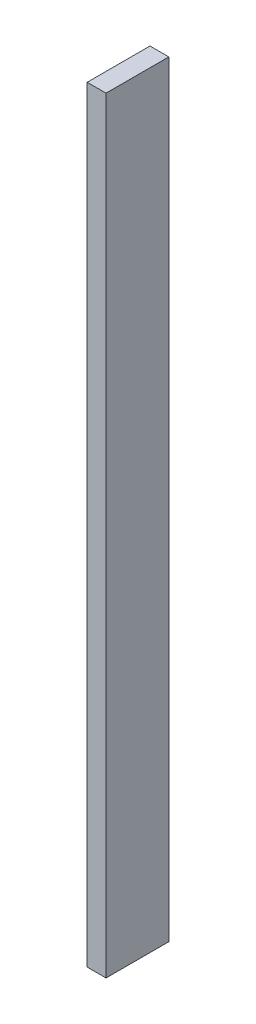
ISO-10303-21;
HEADER;
FILE_DESCRIPTION(('STEP AP214'),'2;1');
FILE_NAME('part.step','',(''),(''),'','','');
FILE_SCHEMA(('AUTOMOTIVE_DESIGN { 1 0 10303 214 1 1 1 1 }'));
ENDSEC;
DATA;
#1=APPLICATION_CONTEXT('core data for automotive mechanical design processes');
#2=APPLICATION_PROTOCOL_DEFINITION('international standard','automotive_design',2000,#1);
#3=PRODUCT_CONTEXT('',#1,'mechanical');
#4=PRODUCT('Part','Part','',(#3));
#5=PRODUCT_RELATED_PRODUCT_CATEGORY('part','',(#4));
#6=PRODUCT_DEFINITION_FORMATION('','',#4);
#7=PRODUCT_DEFINITION_CONTEXT('part definition',#1,'design');
#8=PRODUCT_DEFINITION('design','',#6,#7);
#9=PRODUCT_DEFINITION_SHAPE('','',#8);
#10=(LENGTH_UNIT() NAMED_UNIT(*) SI_UNIT(.MILLI.,.METRE.));
#11=(NAMED_UNIT(*) PLANE_ANGLE_UNIT() SI_UNIT($,.RADIAN.));
#12=(NAMED_UNIT(*) SI_UNIT($,.STERADIAN.) SOLID_ANGLE_UNIT());
#13=UNCERTAINTY_MEASURE_WITH_UNIT(LENGTH_MEASURE(1.E-05),#10,'distance_accuracy_value','');
#14=(GEOMETRIC_REPRESENTATION_CONTEXT(3) GLOBAL_UNCERTAINTY_ASSIGNED_CONTEXT((#13)) GLOBAL_UNIT_ASSIGNED_CONTEXT((#10,
#11,#12)) REPRESENTATION_CONTEXT('',''));
#15=CARTESIAN_POINT('',(0.,0.,0.));
#16=DIRECTION('',(0.,0.,1.));
#17=DIRECTION('',(1.,0.,0.));
#18=AXIS2_PLACEMENT_3D('',#15,#16,#17);
#19=CARTESIAN_POINT('',(1.5,61.,10.));
#20=DIRECTION('',(0.,-1.,0.));
#21=DIRECTION('',(0.,0.,-1.));
#22=AXIS2_PLACEMENT_3D('',#19,#20,#21);
#23=PLANE('',#22);
#24=DIRECTION('',(-1.,0.,0.));
#25=VECTOR('',#24,1.);
#26=CARTESIAN_POINT('',(1.5,61.,0.));
#27=LINE('',#26,#25);
#28=CARTESIAN_POINT('',(1.5,61.,0.));
#29=VERTEX_POINT('',#28);
#30=CARTESIAN_POINT('',(-1.5,61.,0.));
#31=VERTEX_POINT('',#30);
#32=EDGE_CURVE('E105',#29,#31,#27,.T.);
#33=ORIENTED_EDGE('',*,*,#32,.T.);
#34=DIRECTION('',(0.,0.,-1.));
#35=VECTOR('',#34,1.);
#36=CARTESIAN_POINT('',(-1.5,61.,10.));
#37=LINE('',#36,#35);
#38=CARTESIAN_POINT('',(-1.5,61.,10.));
#39=VERTEX_POINT('',#38);
#40=EDGE_CURVE('E11',#39,#31,#37,.T.);
#41=ORIENTED_EDGE('',*,*,#40,.F.);
#42=DIRECTION('',(-1.,0.,0.));
#43=VECTOR('',#42,1.);
#44=CARTESIAN_POINT('',(1.5,61.,10.));
#45=LINE('',#44,#43);
#46=CARTESIAN_POINT('',(1.5,61.,10.));
#47=VERTEX_POINT('',#46);
#48=EDGE_CURVE('E89',#47,#39,#45,.T.);
#49=ORIENTED_EDGE('',*,*,#48,.F.);
#50=DIRECTION('',(0.,0.,-1.));
#51=VECTOR('',#50,1.);
#52=CARTESIAN_POINT('',(1.5,61.,10.));
#53=LINE('',#52,#51);
#54=EDGE_CURVE('E97',#47,#29,#53,.T.);
#55=ORIENTED_EDGE('',*,*,#54,.T.);
#56=EDGE_LOOP('',(#33,#41,#49,#55));
#57=FACE_BOUND('',#56,.T.);
#58=ADVANCED_FACE('F39',(#57),#23,.F.);
#59=CARTESIAN_POINT('',(-1.5,-61.,10.));
#60=DIRECTION('',(1.,0.,0.));
#61=DIRECTION('',(0.,0.,-1.));
#62=AXIS2_PLACEMENT_3D('',#59,#60,#61);
#63=PLANE('',#62);
#64=DIRECTION('',(0.,-1.,0.));
#65=VECTOR('',#64,1.);
#66=CARTESIAN_POINT('',(-1.5,-61.,0.));
#67=LINE('',#66,#65);
#68=CARTESIAN_POINT('',(-1.5,-61.,0.));
#69=VERTEX_POINT('',#68);
#70=EDGE_CURVE('E92',#31,#69,#67,.T.);
#71=ORIENTED_EDGE('',*,*,#70,.T.);
#72=DIRECTION('',(0.,0.,-1.));
#73=VECTOR('',#72,1.);
#74=CARTESIAN_POINT('',(-1.5,-61.,10.));
#75=LINE('',#74,#73);
#76=CARTESIAN_POINT('',(-1.5,-61.,10.));
#77=VERTEX_POINT('',#76);
#78=EDGE_CURVE('E50',#77,#69,#75,.T.);
#79=ORIENTED_EDGE('',*,*,#78,.F.);
#80=DIRECTION('',(0.,-1.,0.));
#81=VECTOR('',#80,1.);
#82=CARTESIAN_POINT('',(-1.5,-61.,10.));
#83=LINE('',#82,#81);
#84=EDGE_CURVE('E82',#39,#77,#83,.T.);
#85=ORIENTED_EDGE('',*,*,#84,.F.);
#86=ORIENTED_EDGE('',*,*,#40,.T.);
#87=EDGE_LOOP('',(#71,#79,#85,#86));
#88=FACE_BOUND('',#87,.T.);
#89=ADVANCED_FACE('F93',(#88),#63,.F.);
#90=CARTESIAN_POINT('',(1.5,-61.,10.));
#91=DIRECTION('',(0.,1.,0.));
#92=DIRECTION('',(0.,0.,1.));
#93=AXIS2_PLACEMENT_3D('',#90,#91,#92);
#94=PLANE('',#93);
#95=DIRECTION('',(1.,0.,0.));
#96=VECTOR('',#95,1.);
#97=CARTESIAN_POINT('',(1.5,-61.,0.));
#98=LINE('',#97,#96);
#99=CARTESIAN_POINT('',(1.5,-61.,0.));
#100=VERTEX_POINT('',#99);
#101=EDGE_CURVE('E74',#69,#100,#98,.T.);
#102=ORIENTED_EDGE('',*,*,#101,.T.);
#103=DIRECTION('',(0.,0.,-1.));
#104=VECTOR('',#103,1.);
#105=CARTESIAN_POINT('',(1.5,-61.,10.));
#106=LINE('',#105,#104);
#107=CARTESIAN_POINT('',(1.5,-61.,10.));
#108=VERTEX_POINT('',#107);
#109=EDGE_CURVE('E94',#108,#100,#106,.T.);
#110=ORIENTED_EDGE('',*,*,#109,.F.);
#111=DIRECTION('',(1.,0.,0.));
#112=VECTOR('',#111,1.);
#113=CARTESIAN_POINT('',(1.5,-61.,10.));
#114=LINE('',#113,#112);
#115=EDGE_CURVE('E88',#77,#108,#114,.T.);
#116=ORIENTED_EDGE('',*,*,#115,.F.);
#117=ORIENTED_EDGE('',*,*,#78,.T.);
#118=EDGE_LOOP('',(#102,#110,#116,#117));
#119=FACE_BOUND('',#118,.T.);
#120=ADVANCED_FACE('F96',(#119),#94,.F.);
#121=CARTESIAN_POINT('',(1.5,-61.,10.));
#122=DIRECTION('',(-1.,0.,0.));
#123=DIRECTION('',(0.,0.,1.));
#124=AXIS2_PLACEMENT_3D('',#121,#122,#123);
#125=PLANE('',#124);
#126=DIRECTION('',(0.,1.,0.));
#127=VECTOR('',#126,1.);
#128=CARTESIAN_POINT('',(1.5,-61.,0.));
#129=LINE('',#128,#127);
#130=EDGE_CURVE('E76',#100,#29,#129,.T.);
#131=ORIENTED_EDGE('',*,*,#130,.T.);
#132=ORIENTED_EDGE('',*,*,#54,.F.);
#133=DIRECTION('',(0.,1.,0.));
#134=VECTOR('',#133,1.);
#135=CARTESIAN_POINT('',(1.5,-61.,10.));
#136=LINE('',#135,#134);
#137=EDGE_CURVE('E54',#108,#47,#136,.T.);
#138=ORIENTED_EDGE('',*,*,#137,.F.);
#139=ORIENTED_EDGE('',*,*,#109,.T.);
#140=EDGE_LOOP('',(#131,#132,#138,#139));
#141=FACE_BOUND('',#140,.T.);
#142=ADVANCED_FACE('F106',(#141),#125,.F.);
#143=CARTESIAN_POINT('',(0.,0.,10.));
#144=DIRECTION('',(0.,0.,-1.));
#145=DIRECTION('',(-1.,0.,0.));
#146=AXIS2_PLACEMENT_3D('',#143,#144,#145);
#147=PLANE('',#146);
#148=ORIENTED_EDGE('',*,*,#48,.T.);
#149=ORIENTED_EDGE('',*,*,#84,.T.);
#150=ORIENTED_EDGE('',*,*,#115,.T.);
#151=ORIENTED_EDGE('',*,*,#137,.T.);
#152=EDGE_LOOP('',(#148,#149,#150,#151));
#153=FACE_BOUND('',#152,.T.);
#154=ADVANCED_FACE('F86',(#153),#147,.F.);
#155=CARTESIAN_POINT('',(0.,0.,0.));
#156=DIRECTION('',(0.,0.,-1.));
#157=DIRECTION('',(-1.,0.,0.));
#158=AXIS2_PLACEMENT_3D('',#155,#156,#157);
#159=PLANE('',#158);
#160=ORIENTED_EDGE('',*,*,#32,.F.);
#161=ORIENTED_EDGE('',*,*,#130,.F.);
#162=ORIENTED_EDGE('',*,*,#101,.F.);
#163=ORIENTED_EDGE('',*,*,#70,.F.);
#164=EDGE_LOOP('',(#160,#161,#162,#163));
#165=FACE_BOUND('',#164,.T.);
#166=ADVANCED_FACE('F115',(#165),#159,.T.);
#167=CLOSED_SHELL('',(#58,#89,#120,#142,#154,#166));
#168=MANIFOLD_SOLID_BREP('B2',#167);
#169=ADVANCED_BREP_SHAPE_REPRESENTATION('',(#18,#168),#14);
#170=SHAPE_DEFINITION_REPRESENTATION(#9,#169);
ENDSEC;
END-ISO-10303-21;
